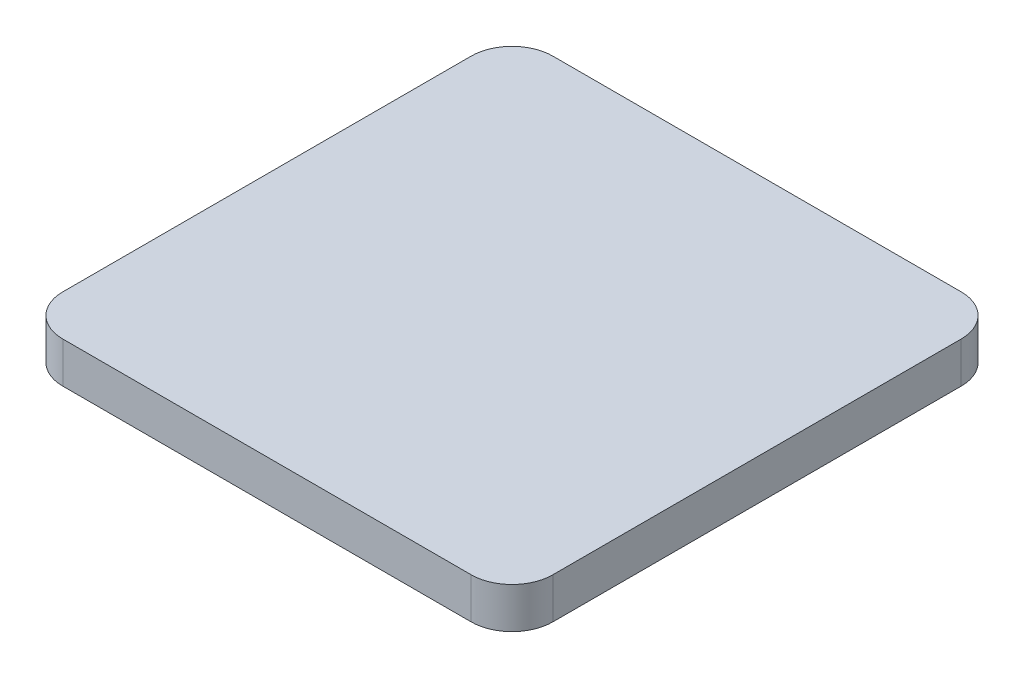
ISO-10303-21;
HEADER;
FILE_DESCRIPTION(('STEP AP214'),'2;1');
FILE_NAME('part.step','',(''),(''),'','','');
FILE_SCHEMA(('AUTOMOTIVE_DESIGN { 1 0 10303 214 1 1 1 1 }'));
ENDSEC;
DATA;
#1=APPLICATION_CONTEXT('core data for automotive mechanical design processes');
#2=APPLICATION_PROTOCOL_DEFINITION('international standard','automotive_design',2000,#1);
#3=PRODUCT_CONTEXT('',#1,'mechanical');
#4=PRODUCT('Part','Part','',(#3));
#5=PRODUCT_RELATED_PRODUCT_CATEGORY('part','',(#4));
#6=PRODUCT_DEFINITION_FORMATION('','',#4);
#7=PRODUCT_DEFINITION_CONTEXT('part definition',#1,'design');
#8=PRODUCT_DEFINITION('design','',#6,#7);
#9=PRODUCT_DEFINITION_SHAPE('','',#8);
#10=(LENGTH_UNIT() NAMED_UNIT(*) SI_UNIT(.MILLI.,.METRE.));
#11=(NAMED_UNIT(*) PLANE_ANGLE_UNIT() SI_UNIT($,.RADIAN.));
#12=(NAMED_UNIT(*) SI_UNIT($,.STERADIAN.) SOLID_ANGLE_UNIT());
#13=UNCERTAINTY_MEASURE_WITH_UNIT(LENGTH_MEASURE(1.E-05),#10,'distance_accuracy_value','');
#14=(GEOMETRIC_REPRESENTATION_CONTEXT(3) GLOBAL_UNCERTAINTY_ASSIGNED_CONTEXT((#13)) GLOBAL_UNIT_ASSIGNED_CONTEXT((#10,
#11,#12)) REPRESENTATION_CONTEXT('',''));
#15=CARTESIAN_POINT('',(0.,0.,0.));
#16=DIRECTION('',(0.,0.,1.));
#17=DIRECTION('',(1.,0.,0.));
#18=AXIS2_PLACEMENT_3D('',#15,#16,#17);
#19=CARTESIAN_POINT('',(30.,5.,-30.));
#20=DIRECTION('',(-1.,0.,0.));
#21=DIRECTION('',(0.,0.,1.));
#22=AXIS2_PLACEMENT_3D('',#19,#20,#21);
#23=PLANE('',#22);
#24=DIRECTION('',(0.,0.,-1.));
#25=VECTOR('',#24,1.);
#26=CARTESIAN_POINT('',(30.,5.,-30.));
#27=LINE('',#26,#25);
#28=CARTESIAN_POINT('',(30.,5.,25.));
#29=VERTEX_POINT('',#28);
#30=CARTESIAN_POINT('',(30.,5.,-25.));
#31=VERTEX_POINT('',#30);
#32=EDGE_CURVE('E128',#29,#31,#27,.T.);
#33=ORIENTED_EDGE('',*,*,#32,.F.);
#34=DIRECTION('',(0.,-1.,0.));
#35=VECTOR('',#34,1.);
#36=CARTESIAN_POINT('',(30.,5.,25.));
#37=LINE('',#36,#35);
#38=CARTESIAN_POINT('',(30.,0.,25.));
#39=VERTEX_POINT('',#38);
#40=EDGE_CURVE('E113',#29,#39,#37,.T.);
#41=ORIENTED_EDGE('',*,*,#40,.T.);
#42=DIRECTION('',(0.,0.,-1.));
#43=VECTOR('',#42,1.);
#44=CARTESIAN_POINT('',(30.,0.,-30.));
#45=LINE('',#44,#43);
#46=CARTESIAN_POINT('',(30.,0.,-25.));
#47=VERTEX_POINT('',#46);
#48=EDGE_CURVE('E125',#39,#47,#45,.T.);
#49=ORIENTED_EDGE('',*,*,#48,.T.);
#50=DIRECTION('',(0.,-1.,0.));
#51=VECTOR('',#50,1.);
#52=CARTESIAN_POINT('',(30.,5.,-25.));
#53=LINE('',#52,#51);
#54=EDGE_CURVE('E130',#47,#31,#53,.F.);
#55=ORIENTED_EDGE('',*,*,#54,.T.);
#56=EDGE_LOOP('',(#33,#41,#49,#55));
#57=FACE_BOUND('',#56,.T.);
#58=ADVANCED_FACE('F43',(#57),#23,.F.);
#59=CARTESIAN_POINT('',(-30.,5.,-30.));
#60=DIRECTION('',(0.,0.,1.));
#61=DIRECTION('',(1.,0.,0.));
#62=AXIS2_PLACEMENT_3D('',#59,#60,#61);
#63=PLANE('',#62);
#64=DIRECTION('',(-1.,0.,0.));
#65=VECTOR('',#64,1.);
#66=CARTESIAN_POINT('',(-30.,5.,-30.));
#67=LINE('',#66,#65);
#68=CARTESIAN_POINT('',(25.,5.,-30.));
#69=VERTEX_POINT('',#68);
#70=CARTESIAN_POINT('',(-25.,5.,-30.));
#71=VERTEX_POINT('',#70);
#72=EDGE_CURVE('E170',#69,#71,#67,.T.);
#73=ORIENTED_EDGE('',*,*,#72,.F.);
#74=DIRECTION('',(0.,-1.,0.));
#75=VECTOR('',#74,1.);
#76=CARTESIAN_POINT('',(25.,5.,-30.));
#77=LINE('',#76,#75);
#78=CARTESIAN_POINT('',(25.,0.,-30.));
#79=VERTEX_POINT('',#78);
#80=EDGE_CURVE('E163',#69,#79,#77,.T.);
#81=ORIENTED_EDGE('',*,*,#80,.T.);
#82=DIRECTION('',(-1.,0.,0.));
#83=VECTOR('',#82,1.);
#84=CARTESIAN_POINT('',(-30.,0.,-30.));
#85=LINE('',#84,#83);
#86=CARTESIAN_POINT('',(-25.,0.,-30.));
#87=VERTEX_POINT('',#86);
#88=EDGE_CURVE('E134',#79,#87,#85,.T.);
#89=ORIENTED_EDGE('',*,*,#88,.T.);
#90=DIRECTION('',(0.,-1.,0.));
#91=VECTOR('',#90,1.);
#92=CARTESIAN_POINT('',(-25.,5.,-30.));
#93=LINE('',#92,#91);
#94=EDGE_CURVE('E161',#87,#71,#93,.F.);
#95=ORIENTED_EDGE('',*,*,#94,.T.);
#96=EDGE_LOOP('',(#73,#81,#89,#95));
#97=FACE_BOUND('',#96,.T.);
#98=ADVANCED_FACE('F168',(#97),#63,.F.);
#99=CARTESIAN_POINT('',(-30.,5.,-30.));
#100=DIRECTION('',(1.,0.,0.));
#101=DIRECTION('',(0.,0.,-1.));
#102=AXIS2_PLACEMENT_3D('',#99,#100,#101);
#103=PLANE('',#102);
#104=DIRECTION('',(0.,0.,1.));
#105=VECTOR('',#104,1.);
#106=CARTESIAN_POINT('',(-30.,5.,-30.));
#107=LINE('',#106,#105);
#108=CARTESIAN_POINT('',(-30.,5.,-25.));
#109=VERTEX_POINT('',#108);
#110=CARTESIAN_POINT('',(-30.,5.,25.));
#111=VERTEX_POINT('',#110);
#112=EDGE_CURVE('E178',#109,#111,#107,.T.);
#113=ORIENTED_EDGE('',*,*,#112,.F.);
#114=DIRECTION('',(0.,-1.,0.));
#115=VECTOR('',#114,1.);
#116=CARTESIAN_POINT('',(-30.,5.,-25.));
#117=LINE('',#116,#115);
#118=CARTESIAN_POINT('',(-30.,0.,-25.));
#119=VERTEX_POINT('',#118);
#120=EDGE_CURVE('E11',#109,#119,#117,.T.);
#121=ORIENTED_EDGE('',*,*,#120,.T.);
#122=DIRECTION('',(0.,0.,1.));
#123=VECTOR('',#122,1.);
#124=CARTESIAN_POINT('',(-30.,0.,-30.));
#125=LINE('',#124,#123);
#126=CARTESIAN_POINT('',(-30.,0.,25.));
#127=VERTEX_POINT('',#126);
#128=EDGE_CURVE('E137',#119,#127,#125,.T.);
#129=ORIENTED_EDGE('',*,*,#128,.T.);
#130=DIRECTION('',(0.,-1.,0.));
#131=VECTOR('',#130,1.);
#132=CARTESIAN_POINT('',(-30.,5.,25.));
#133=LINE('',#132,#131);
#134=EDGE_CURVE('E51',#127,#111,#133,.F.);
#135=ORIENTED_EDGE('',*,*,#134,.T.);
#136=EDGE_LOOP('',(#113,#121,#129,#135));
#137=FACE_BOUND('',#136,.T.);
#138=ADVANCED_FACE('F177',(#137),#103,.F.);
#139=CARTESIAN_POINT('',(-30.,5.,30.));
#140=DIRECTION('',(0.,0.,-1.));
#141=DIRECTION('',(-1.,0.,0.));
#142=AXIS2_PLACEMENT_3D('',#139,#140,#141);
#143=PLANE('',#142);
#144=DIRECTION('',(1.,0.,0.));
#145=VECTOR('',#144,1.);
#146=CARTESIAN_POINT('',(-30.,0.,30.));
#147=LINE('',#146,#145);
#148=CARTESIAN_POINT('',(-25.,0.,30.));
#149=VERTEX_POINT('',#148);
#150=CARTESIAN_POINT('',(25.,0.,30.));
#151=VERTEX_POINT('',#150);
#152=EDGE_CURVE('E144',#149,#151,#147,.T.);
#153=ORIENTED_EDGE('',*,*,#152,.T.);
#154=DIRECTION('',(0.,-1.,0.));
#155=VECTOR('',#154,1.);
#156=CARTESIAN_POINT('',(25.,5.,30.));
#157=LINE('',#156,#155);
#158=CARTESIAN_POINT('',(25.,5.,30.));
#159=VERTEX_POINT('',#158);
#160=EDGE_CURVE('E114',#151,#159,#157,.F.);
#161=ORIENTED_EDGE('',*,*,#160,.T.);
#162=DIRECTION('',(1.,0.,0.));
#163=VECTOR('',#162,1.);
#164=CARTESIAN_POINT('',(-30.,5.,30.));
#165=LINE('',#164,#163);
#166=CARTESIAN_POINT('',(-25.,5.,30.));
#167=VERTEX_POINT('',#166);
#168=EDGE_CURVE('E140',#167,#159,#165,.T.);
#169=ORIENTED_EDGE('',*,*,#168,.F.);
#170=DIRECTION('',(0.,-1.,0.));
#171=VECTOR('',#170,1.);
#172=CARTESIAN_POINT('',(-25.,5.,30.));
#173=LINE('',#172,#171);
#174=EDGE_CURVE('E119',#167,#149,#173,.T.);
#175=ORIENTED_EDGE('',*,*,#174,.T.);
#176=EDGE_LOOP('',(#153,#161,#169,#175));
#177=FACE_BOUND('',#176,.T.);
#178=ADVANCED_FACE('F201',(#177),#143,.F.);
#179=CARTESIAN_POINT('',(0.,5.,0.));
#180=DIRECTION('',(0.,1.,0.));
#181=DIRECTION('',(0.,0.,1.));
#182=AXIS2_PLACEMENT_3D('',#179,#180,#181);
#183=PLANE('',#182);
#184=ORIENTED_EDGE('',*,*,#168,.T.);
#185=CARTESIAN_POINT('',(25.,5.,25.));
#186=DIRECTION('',(0.,1.,0.));
#187=DIRECTION('',(0.,0.,1.));
#188=AXIS2_PLACEMENT_3D('',#185,#186,#187);
#189=CIRCLE('',#188,5.);
#190=EDGE_CURVE('E159',#159,#29,#189,.T.);
#191=ORIENTED_EDGE('',*,*,#190,.T.);
#192=ORIENTED_EDGE('',*,*,#32,.T.);
#193=CARTESIAN_POINT('',(25.,5.,-25.));
#194=DIRECTION('',(0.,1.,0.));
#195=DIRECTION('',(0.,0.,1.));
#196=AXIS2_PLACEMENT_3D('',#193,#194,#195);
#197=CIRCLE('',#196,5.);
#198=EDGE_CURVE('E157',#31,#69,#197,.T.);
#199=ORIENTED_EDGE('',*,*,#198,.T.);
#200=ORIENTED_EDGE('',*,*,#72,.T.);
#201=CARTESIAN_POINT('',(-25.,5.,-25.));
#202=DIRECTION('',(0.,1.,0.));
#203=DIRECTION('',(0.,0.,1.));
#204=AXIS2_PLACEMENT_3D('',#201,#202,#203);
#205=CIRCLE('',#204,5.);
#206=EDGE_CURVE('E64',#71,#109,#205,.T.);
#207=ORIENTED_EDGE('',*,*,#206,.T.);
#208=ORIENTED_EDGE('',*,*,#112,.T.);
#209=CARTESIAN_POINT('',(-25.,5.,25.));
#210=DIRECTION('',(0.,1.,0.));
#211=DIRECTION('',(0.,0.,1.));
#212=AXIS2_PLACEMENT_3D('',#209,#210,#211);
#213=CIRCLE('',#212,5.);
#214=EDGE_CURVE('E154',#111,#167,#213,.T.);
#215=ORIENTED_EDGE('',*,*,#214,.T.);
#216=EDGE_LOOP('',(#184,#191,#192,#199,#200,#207,#208,#215));
#217=FACE_BOUND('',#216,.T.);
#218=ADVANCED_FACE('F183',(#217),#183,.T.);
#219=CARTESIAN_POINT('',(0.,0.,0.));
#220=DIRECTION('',(0.,1.,0.));
#221=DIRECTION('',(0.,0.,1.));
#222=AXIS2_PLACEMENT_3D('',#219,#220,#221);
#223=PLANE('',#222);
#224=ORIENTED_EDGE('',*,*,#48,.F.);
#225=CARTESIAN_POINT('',(25.,0.,25.));
#226=DIRECTION('',(0.,1.,0.));
#227=DIRECTION('',(0.,0.,1.));
#228=AXIS2_PLACEMENT_3D('',#225,#226,#227);
#229=CIRCLE('',#228,5.);
#230=EDGE_CURVE('E109',#39,#151,#229,.F.);
#231=ORIENTED_EDGE('',*,*,#230,.T.);
#232=ORIENTED_EDGE('',*,*,#152,.F.);
#233=CARTESIAN_POINT('',(-25.,0.,25.));
#234=DIRECTION('',(0.,1.,0.));
#235=DIRECTION('',(0.,0.,1.));
#236=AXIS2_PLACEMENT_3D('',#233,#234,#235);
#237=CIRCLE('',#236,5.);
#238=EDGE_CURVE('E129',#149,#127,#237,.F.);
#239=ORIENTED_EDGE('',*,*,#238,.T.);
#240=ORIENTED_EDGE('',*,*,#128,.F.);
#241=CARTESIAN_POINT('',(-25.,0.,-25.));
#242=DIRECTION('',(0.,1.,0.));
#243=DIRECTION('',(0.,0.,1.));
#244=AXIS2_PLACEMENT_3D('',#241,#242,#243);
#245=CIRCLE('',#244,5.);
#246=EDGE_CURVE('E148',#119,#87,#245,.F.);
#247=ORIENTED_EDGE('',*,*,#246,.T.);
#248=ORIENTED_EDGE('',*,*,#88,.F.);
#249=CARTESIAN_POINT('',(25.,0.,-25.));
#250=DIRECTION('',(0.,1.,0.));
#251=DIRECTION('',(0.,0.,1.));
#252=AXIS2_PLACEMENT_3D('',#249,#250,#251);
#253=CIRCLE('',#252,5.);
#254=EDGE_CURVE('E120',#79,#47,#253,.F.);
#255=ORIENTED_EDGE('',*,*,#254,.T.);
#256=EDGE_LOOP('',(#224,#231,#232,#239,#240,#247,#248,#255));
#257=FACE_BOUND('',#256,.T.);
#258=ADVANCED_FACE('F132',(#257),#223,.F.);
#259=CARTESIAN_POINT('',(25.,5.,25.));
#260=DIRECTION('',(0.,-1.,0.));
#261=DIRECTION('',(0.,0.,-1.));
#262=AXIS2_PLACEMENT_3D('',#259,#260,#261);
#263=CYLINDRICAL_SURFACE('',#262,5.);
#264=ORIENTED_EDGE('',*,*,#190,.F.);
#265=ORIENTED_EDGE('',*,*,#160,.F.);
#266=ORIENTED_EDGE('',*,*,#230,.F.);
#267=ORIENTED_EDGE('',*,*,#40,.F.);
#268=EDGE_LOOP('',(#264,#265,#266,#267));
#269=FACE_BOUND('',#268,.T.);
#270=ADVANCED_FACE('F112',(#269),#263,.T.);
#271=CARTESIAN_POINT('',(25.,5.,-25.));
#272=DIRECTION('',(0.,-1.,0.));
#273=DIRECTION('',(0.,0.,-1.));
#274=AXIS2_PLACEMENT_3D('',#271,#272,#273);
#275=CYLINDRICAL_SURFACE('',#274,5.);
#276=ORIENTED_EDGE('',*,*,#198,.F.);
#277=ORIENTED_EDGE('',*,*,#54,.F.);
#278=ORIENTED_EDGE('',*,*,#254,.F.);
#279=ORIENTED_EDGE('',*,*,#80,.F.);
#280=EDGE_LOOP('',(#276,#277,#278,#279));
#281=FACE_BOUND('',#280,.T.);
#282=ADVANCED_FACE('F184',(#281),#275,.T.);
#283=CARTESIAN_POINT('',(-25.,5.,-25.));
#284=DIRECTION('',(0.,-1.,0.));
#285=DIRECTION('',(0.,0.,-1.));
#286=AXIS2_PLACEMENT_3D('',#283,#284,#285);
#287=CYLINDRICAL_SURFACE('',#286,5.);
#288=ORIENTED_EDGE('',*,*,#206,.F.);
#289=ORIENTED_EDGE('',*,*,#94,.F.);
#290=ORIENTED_EDGE('',*,*,#246,.F.);
#291=ORIENTED_EDGE('',*,*,#120,.F.);
#292=EDGE_LOOP('',(#288,#289,#290,#291));
#293=FACE_BOUND('',#292,.T.);
#294=ADVANCED_FACE('F176',(#293),#287,.T.);
#295=CARTESIAN_POINT('',(-25.,5.,25.));
#296=DIRECTION('',(0.,-1.,0.));
#297=DIRECTION('',(0.,0.,-1.));
#298=AXIS2_PLACEMENT_3D('',#295,#296,#297);
#299=CYLINDRICAL_SURFACE('',#298,5.);
#300=ORIENTED_EDGE('',*,*,#214,.F.);
#301=ORIENTED_EDGE('',*,*,#134,.F.);
#302=ORIENTED_EDGE('',*,*,#238,.F.);
#303=ORIENTED_EDGE('',*,*,#174,.F.);
#304=EDGE_LOOP('',(#300,#301,#302,#303));
#305=FACE_BOUND('',#304,.T.);
#306=ADVANCED_FACE('F45',(#305),#299,.T.);
#307=CLOSED_SHELL('',(#58,#98,#138,#178,#218,#258,#270,#282,#294,#306));
#308=MANIFOLD_SOLID_BREP('B2',#307);
#309=ADVANCED_BREP_SHAPE_REPRESENTATION('',(#18,#308),#14);
#310=SHAPE_DEFINITION_REPRESENTATION(#9,#309);
ENDSEC;
END-ISO-10303-21;
